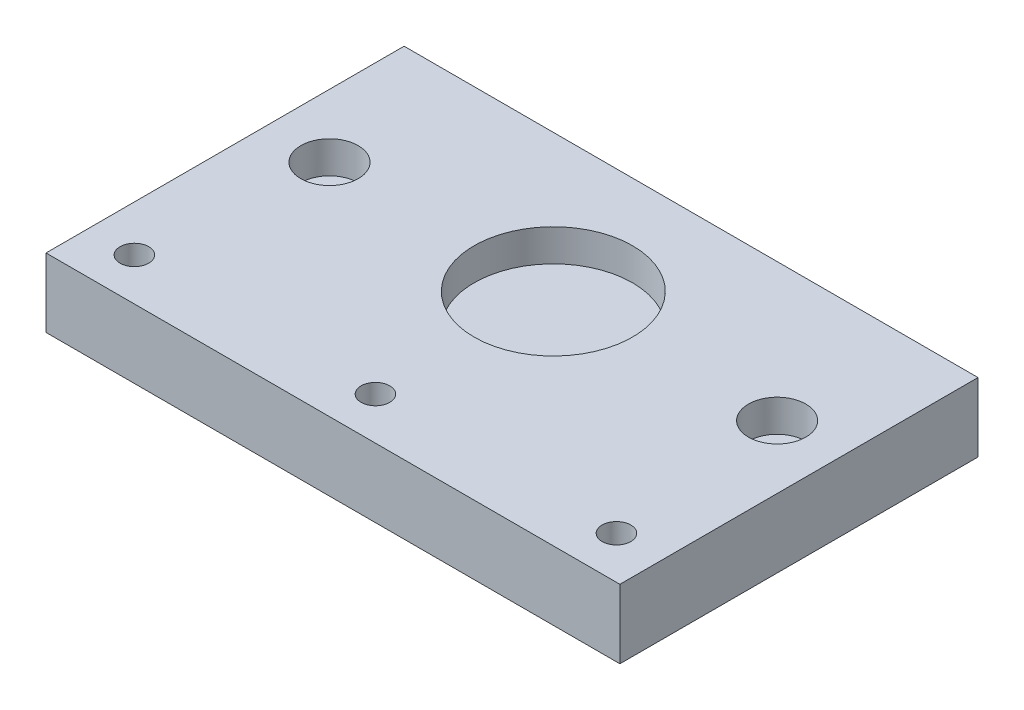
ISO-10303-21;
HEADER;
FILE_DESCRIPTION(('STEP AP214'),'2;1');
FILE_NAME('part.step','',(''),(''),'','','');
FILE_SCHEMA(('AUTOMOTIVE_DESIGN { 1 0 10303 214 1 1 1 1 }'));
ENDSEC;
DATA;
#1=APPLICATION_CONTEXT('core data for automotive mechanical design processes');
#2=APPLICATION_PROTOCOL_DEFINITION('international standard','automotive_design',2000,#1);
#3=PRODUCT_CONTEXT('',#1,'mechanical');
#4=PRODUCT('Part','Part','',(#3));
#5=PRODUCT_RELATED_PRODUCT_CATEGORY('part','',(#4));
#6=PRODUCT_DEFINITION_FORMATION('','',#4);
#7=PRODUCT_DEFINITION_CONTEXT('part definition',#1,'design');
#8=PRODUCT_DEFINITION('design','',#6,#7);
#9=PRODUCT_DEFINITION_SHAPE('','',#8);
#10=(LENGTH_UNIT() NAMED_UNIT(*) SI_UNIT(.MILLI.,.METRE.));
#11=(NAMED_UNIT(*) PLANE_ANGLE_UNIT() SI_UNIT($,.RADIAN.));
#12=(NAMED_UNIT(*) SI_UNIT($,.STERADIAN.) SOLID_ANGLE_UNIT());
#13=UNCERTAINTY_MEASURE_WITH_UNIT(LENGTH_MEASURE(1.E-05),#10,'distance_accuracy_value','');
#14=(GEOMETRIC_REPRESENTATION_CONTEXT(3) GLOBAL_UNCERTAINTY_ASSIGNED_CONTEXT((#13)) GLOBAL_UNIT_ASSIGNED_CONTEXT((#10,
#11,#12)) REPRESENTATION_CONTEXT('',''));
#15=CARTESIAN_POINT('',(0.,0.,0.));
#16=DIRECTION('',(0.,0.,1.));
#17=DIRECTION('',(1.,0.,0.));
#18=AXIS2_PLACEMENT_3D('',#15,#16,#17);
#19=CARTESIAN_POINT('',(-24.765,0.,15.24));
#20=DIRECTION('',(0.,-1.,0.));
#21=DIRECTION('',(0.,0.,-1.));
#22=AXIS2_PLACEMENT_3D('',#19,#20,#21);
#23=CYLINDRICAL_SURFACE('',#22,3.175);
#24=CARTESIAN_POINT('',(-24.765,-6.35,15.24));
#25=DIRECTION('',(0.,1.,0.));
#26=DIRECTION('',(0.,0.,1.));
#27=AXIS2_PLACEMENT_3D('',#24,#25,#26);
#28=CIRCLE('',#27,3.175);
#29=CARTESIAN_POINT('',(-24.765,-6.35,18.415));
#30=VERTEX_POINT('',#29);
#31=EDGE_CURVE('E118',#30,#30,#28,.F.);
#32=ORIENTED_EDGE('',*,*,#31,.F.);
#33=EDGE_LOOP('',(#32));
#34=FACE_BOUND('',#33,.T.);
#35=CARTESIAN_POINT('',(-24.765,-9.906,15.24));
#36=DIRECTION('',(0.,-1.,0.));
#37=DIRECTION('',(0.,0.,-1.));
#38=AXIS2_PLACEMENT_3D('',#35,#36,#37);
#39=CIRCLE('',#38,3.175);
#40=CARTESIAN_POINT('',(-24.765,-9.906,12.065));
#41=VERTEX_POINT('',#40);
#42=EDGE_CURVE('E11',#41,#41,#39,.F.);
#43=ORIENTED_EDGE('',*,*,#42,.F.);
#44=EDGE_LOOP('',(#43));
#45=FACE_BOUND('',#44,.T.);
#46=ADVANCED_FACE('F37',(#34,#45),#23,.F.);
#47=CARTESIAN_POINT('',(24.765,0.,15.24));
#48=DIRECTION('',(0.,-1.,0.));
#49=DIRECTION('',(0.,0.,-1.));
#50=AXIS2_PLACEMENT_3D('',#47,#48,#49);
#51=CYLINDRICAL_SURFACE('',#50,3.175);
#52=CARTESIAN_POINT('',(24.765,-6.35,15.24));
#53=DIRECTION('',(0.,1.,0.));
#54=DIRECTION('',(0.,0.,1.));
#55=AXIS2_PLACEMENT_3D('',#52,#53,#54);
#56=CIRCLE('',#55,3.175);
#57=CARTESIAN_POINT('',(24.765,-6.35,18.415));
#58=VERTEX_POINT('',#57);
#59=EDGE_CURVE('E115',#58,#58,#56,.F.);
#60=ORIENTED_EDGE('',*,*,#59,.F.);
#61=EDGE_LOOP('',(#60));
#62=FACE_BOUND('',#61,.T.);
#63=CARTESIAN_POINT('',(24.765,-9.906,15.24));
#64=DIRECTION('',(0.,-1.,0.));
#65=DIRECTION('',(0.,0.,-1.));
#66=AXIS2_PLACEMENT_3D('',#63,#64,#65);
#67=CIRCLE('',#66,3.175);
#68=CARTESIAN_POINT('',(24.765,-9.906,12.065));
#69=VERTEX_POINT('',#68);
#70=EDGE_CURVE('E45',#69,#69,#67,.F.);
#71=ORIENTED_EDGE('',*,*,#70,.F.);
#72=EDGE_LOOP('',(#71));
#73=FACE_BOUND('',#72,.T.);
#74=ADVANCED_FACE('F142',(#62,#73),#51,.F.);
#75=CARTESIAN_POINT('',(0.,-7.874,15.24));
#76=DIRECTION('',(0.,-1.,0.));
#77=DIRECTION('',(0.,0.,-1.));
#78=AXIS2_PLACEMENT_3D('',#75,#76,#77);
#79=CYLINDRICAL_SURFACE('',#78,8.763);
#80=CARTESIAN_POINT('',(0.,-6.34999999999999,15.24));
#81=DIRECTION('',(0.,-1.,0.));
#82=DIRECTION('',(0.,0.,-1.));
#83=AXIS2_PLACEMENT_3D('',#80,#81,#82);
#84=CIRCLE('',#83,8.763);
#85=CARTESIAN_POINT('',(0.,-6.34999999999999,6.47700000000001));
#86=VERTEX_POINT('',#85);
#87=EDGE_CURVE('E216',#86,#86,#84,.T.);
#88=ORIENTED_EDGE('',*,*,#87,.F.);
#89=EDGE_LOOP('',(#88));
#90=FACE_BOUND('',#89,.T.);
#91=CARTESIAN_POINT('',(0.,-9.906,15.24));
#92=DIRECTION('',(0.,-1.,0.));
#93=DIRECTION('',(0.,0.,-1.));
#94=AXIS2_PLACEMENT_3D('',#91,#92,#93);
#95=CIRCLE('',#94,8.763);
#96=CARTESIAN_POINT('',(0.,-9.906,6.47700000000001));
#97=VERTEX_POINT('',#96);
#98=EDGE_CURVE('E135',#97,#97,#95,.F.);
#99=ORIENTED_EDGE('',*,*,#98,.F.);
#100=EDGE_LOOP('',(#99));
#101=FACE_BOUND('',#100,.T.);
#102=ADVANCED_FACE('F144',(#90,#101),#79,.F.);
#103=CARTESIAN_POINT('',(-31.75,12.7,38.1));
#104=DIRECTION('',(1.,0.,0.));
#105=DIRECTION('',(0.,0.,-1.));
#106=AXIS2_PLACEMENT_3D('',#103,#104,#105);
#107=PLANE('',#106);
#108=DIRECTION('',(0.,0.,1.));
#109=VECTOR('',#108,1.);
#110=CARTESIAN_POINT('',(-31.75,-6.35,38.1));
#111=LINE('',#110,#109);
#112=CARTESIAN_POINT('',(-31.75,-6.35,0.));
#113=VERTEX_POINT('',#112);
#114=CARTESIAN_POINT('',(-31.75,-6.34999999999999,39.624));
#115=VERTEX_POINT('',#114);
#116=EDGE_CURVE('E52',#113,#115,#111,.T.);
#117=ORIENTED_EDGE('',*,*,#116,.F.);
#118=DIRECTION('',(0.,-1.,0.));
#119=VECTOR('',#118,1.);
#120=CARTESIAN_POINT('',(-31.75,12.7,0.));
#121=LINE('',#120,#119);
#122=CARTESIAN_POINT('',(-31.75,-13.97,0.));
#123=VERTEX_POINT('',#122);
#124=EDGE_CURVE('E85',#113,#123,#121,.T.);
#125=ORIENTED_EDGE('',*,*,#124,.T.);
#126=DIRECTION('',(0.,0.,-1.));
#127=VECTOR('',#126,1.);
#128=CARTESIAN_POINT('',(-31.75,-13.97,39.624));
#129=LINE('',#128,#127);
#130=CARTESIAN_POINT('',(-31.75,-13.97,39.624));
#131=VERTEX_POINT('',#130);
#132=EDGE_CURVE('E101',#131,#123,#129,.T.);
#133=ORIENTED_EDGE('',*,*,#132,.F.);
#134=DIRECTION('',(0.,-1.,0.));
#135=VECTOR('',#134,1.);
#136=CARTESIAN_POINT('',(-31.75,12.7,39.624));
#137=LINE('',#136,#135);
#138=EDGE_CURVE('E130',#115,#131,#137,.T.);
#139=ORIENTED_EDGE('',*,*,#138,.F.);
#140=EDGE_LOOP('',(#117,#125,#133,#139));
#141=FACE_BOUND('',#140,.T.);
#142=ADVANCED_FACE('F39',(#141),#107,.F.);
#143=CARTESIAN_POINT('',(31.75,12.7,38.1));
#144=DIRECTION('',(-1.,0.,0.));
#145=DIRECTION('',(0.,0.,1.));
#146=AXIS2_PLACEMENT_3D('',#143,#144,#145);
#147=PLANE('',#146);
#148=DIRECTION('',(0.,0.,-1.));
#149=VECTOR('',#148,1.);
#150=CARTESIAN_POINT('',(31.75,-6.35,38.1));
#151=LINE('',#150,#149);
#152=CARTESIAN_POINT('',(31.75,-6.35,39.624));
#153=VERTEX_POINT('',#152);
#154=CARTESIAN_POINT('',(31.75,-6.35,0.));
#155=VERTEX_POINT('',#154);
#156=EDGE_CURVE('E111',#153,#155,#151,.T.);
#157=ORIENTED_EDGE('',*,*,#156,.F.);
#158=DIRECTION('',(0.,1.,0.));
#159=VECTOR('',#158,1.);
#160=CARTESIAN_POINT('',(31.75,-11.43,39.624));
#161=LINE('',#160,#159);
#162=CARTESIAN_POINT('',(31.75,-13.97,39.624));
#163=VERTEX_POINT('',#162);
#164=EDGE_CURVE('E91',#163,#153,#161,.T.);
#165=ORIENTED_EDGE('',*,*,#164,.F.);
#166=DIRECTION('',(0.,0.,1.));
#167=VECTOR('',#166,1.);
#168=CARTESIAN_POINT('',(31.75,-13.97,0.));
#169=LINE('',#168,#167);
#170=CARTESIAN_POINT('',(31.75,-13.97,0.));
#171=VERTEX_POINT('',#170);
#172=EDGE_CURVE('E88',#171,#163,#169,.T.);
#173=ORIENTED_EDGE('',*,*,#172,.F.);
#174=DIRECTION('',(0.,1.,0.));
#175=VECTOR('',#174,1.);
#176=CARTESIAN_POINT('',(31.75,12.7,0.));
#177=LINE('',#176,#175);
#178=EDGE_CURVE('E76',#171,#155,#177,.T.);
#179=ORIENTED_EDGE('',*,*,#178,.T.);
#180=EDGE_LOOP('',(#157,#165,#173,#179));
#181=FACE_BOUND('',#180,.T.);
#182=ADVANCED_FACE('F89',(#181),#147,.F.);
#183=CARTESIAN_POINT('',(0.,0.,0.));
#184=DIRECTION('',(0.,0.,1.));
#185=DIRECTION('',(1.,0.,0.));
#186=AXIS2_PLACEMENT_3D('',#183,#184,#185);
#187=PLANE('',#186);
#188=DIRECTION('',(-1.,0.,0.));
#189=VECTOR('',#188,1.);
#190=CARTESIAN_POINT('',(0.,-6.35,0.));
#191=LINE('',#190,#189);
#192=EDGE_CURVE('E57',#155,#113,#191,.T.);
#193=ORIENTED_EDGE('',*,*,#192,.F.);
#194=ORIENTED_EDGE('',*,*,#178,.F.);
#195=DIRECTION('',(1.,0.,0.));
#196=VECTOR('',#195,1.);
#197=CARTESIAN_POINT('',(-31.75,-13.97,0.));
#198=LINE('',#197,#196);
#199=EDGE_CURVE('E81',#123,#171,#198,.T.);
#200=ORIENTED_EDGE('',*,*,#199,.F.);
#201=ORIENTED_EDGE('',*,*,#124,.F.);
#202=EDGE_LOOP('',(#193,#194,#200,#201));
#203=FACE_BOUND('',#202,.T.);
#204=ADVANCED_FACE('F78',(#203),#187,.F.);
#205=CARTESIAN_POINT('',(26.67,-38.1,34.925));
#206=DIRECTION('',(0.,1.,0.));
#207=DIRECTION('',(0.,0.,1.));
#208=AXIS2_PLACEMENT_3D('',#205,#206,#207);
#209=CYLINDRICAL_SURFACE('',#208,1.5875);
#210=CARTESIAN_POINT('',(26.67,-6.35,34.925));
#211=DIRECTION('',(0.,1.,0.));
#212=DIRECTION('',(0.,0.,1.));
#213=AXIS2_PLACEMENT_3D('',#210,#211,#212);
#214=CIRCLE('',#213,1.5875);
#215=CARTESIAN_POINT('',(26.67,-6.35,36.5125));
#216=VERTEX_POINT('',#215);
#217=EDGE_CURVE('E127',#216,#216,#214,.F.);
#218=ORIENTED_EDGE('',*,*,#217,.F.);
#219=EDGE_LOOP('',(#218));
#220=FACE_BOUND('',#219,.T.);
#221=CARTESIAN_POINT('',(26.67,-13.97,34.925));
#222=DIRECTION('',(0.,-1.,0.));
#223=DIRECTION('',(0.,0.,-1.));
#224=AXIS2_PLACEMENT_3D('',#221,#222,#223);
#225=CIRCLE('',#224,1.5875);
#226=CARTESIAN_POINT('',(26.67,-13.97,33.3375));
#227=VERTEX_POINT('',#226);
#228=EDGE_CURVE('E102',#227,#227,#225,.T.);
#229=ORIENTED_EDGE('',*,*,#228,.T.);
#230=EDGE_LOOP('',(#229));
#231=FACE_BOUND('',#230,.T.);
#232=ADVANCED_FACE('F158',(#220,#231),#209,.F.);
#233=CARTESIAN_POINT('',(0.,-38.1,34.925));
#234=DIRECTION('',(0.,1.,0.));
#235=DIRECTION('',(0.,0.,1.));
#236=AXIS2_PLACEMENT_3D('',#233,#234,#235);
#237=CYLINDRICAL_SURFACE('',#236,1.5875);
#238=CARTESIAN_POINT('',(0.,-6.35,34.925));
#239=DIRECTION('',(0.,1.,0.));
#240=DIRECTION('',(0.,0.,1.));
#241=AXIS2_PLACEMENT_3D('',#238,#239,#240);
#242=CIRCLE('',#241,1.5875);
#243=CARTESIAN_POINT('',(0.,-6.35,36.5125));
#244=VERTEX_POINT('',#243);
#245=EDGE_CURVE('E124',#244,#244,#242,.F.);
#246=ORIENTED_EDGE('',*,*,#245,.F.);
#247=EDGE_LOOP('',(#246));
#248=FACE_BOUND('',#247,.T.);
#249=CARTESIAN_POINT('',(0.,-13.97,34.925));
#250=DIRECTION('',(0.,-1.,0.));
#251=DIRECTION('',(0.,0.,-1.));
#252=AXIS2_PLACEMENT_3D('',#249,#250,#251);
#253=CIRCLE('',#252,1.5875);
#254=CARTESIAN_POINT('',(0.,-13.97,33.3375));
#255=VERTEX_POINT('',#254);
#256=EDGE_CURVE('E105',#255,#255,#253,.T.);
#257=ORIENTED_EDGE('',*,*,#256,.T.);
#258=EDGE_LOOP('',(#257));
#259=FACE_BOUND('',#258,.T.);
#260=ADVANCED_FACE('F185',(#248,#259),#237,.F.);
#261=CARTESIAN_POINT('',(-26.67,-38.1,34.925));
#262=DIRECTION('',(0.,1.,0.));
#263=DIRECTION('',(0.,0.,1.));
#264=AXIS2_PLACEMENT_3D('',#261,#262,#263);
#265=CYLINDRICAL_SURFACE('',#264,1.5875);
#266=CARTESIAN_POINT('',(-26.67,-6.35,34.925));
#267=DIRECTION('',(0.,1.,0.));
#268=DIRECTION('',(0.,0.,1.));
#269=AXIS2_PLACEMENT_3D('',#266,#267,#268);
#270=CIRCLE('',#269,1.5875);
#271=CARTESIAN_POINT('',(-26.67,-6.35,36.5125));
#272=VERTEX_POINT('',#271);
#273=EDGE_CURVE('E121',#272,#272,#270,.F.);
#274=ORIENTED_EDGE('',*,*,#273,.F.);
#275=EDGE_LOOP('',(#274));
#276=FACE_BOUND('',#275,.T.);
#277=CARTESIAN_POINT('',(-26.67,-13.97,34.925));
#278=DIRECTION('',(0.,-1.,0.));
#279=DIRECTION('',(0.,0.,-1.));
#280=AXIS2_PLACEMENT_3D('',#277,#278,#279);
#281=CIRCLE('',#280,1.5875);
#282=CARTESIAN_POINT('',(-26.67,-13.97,33.3375));
#283=VERTEX_POINT('',#282);
#284=EDGE_CURVE('E214',#283,#283,#281,.T.);
#285=ORIENTED_EDGE('',*,*,#284,.T.);
#286=EDGE_LOOP('',(#285));
#287=FACE_BOUND('',#286,.T.);
#288=ADVANCED_FACE('F203',(#276,#287),#265,.F.);
#289=CARTESIAN_POINT('',(0.,0.,39.624));
#290=DIRECTION('',(0.,0.,1.));
#291=DIRECTION('',(1.,0.,0.));
#292=AXIS2_PLACEMENT_3D('',#289,#290,#291);
#293=PLANE('',#292);
#294=ORIENTED_EDGE('',*,*,#164,.T.);
#295=DIRECTION('',(-1.,0.,0.));
#296=VECTOR('',#295,1.);
#297=CARTESIAN_POINT('',(0.,-6.35,39.624));
#298=LINE('',#297,#296);
#299=EDGE_CURVE('E84',#153,#115,#298,.T.);
#300=ORIENTED_EDGE('',*,*,#299,.T.);
#301=ORIENTED_EDGE('',*,*,#138,.T.);
#302=DIRECTION('',(-1.,0.,0.));
#303=VECTOR('',#302,1.);
#304=CARTESIAN_POINT('',(31.75,-13.97,39.624));
#305=LINE('',#304,#303);
#306=EDGE_CURVE('E95',#163,#131,#305,.T.);
#307=ORIENTED_EDGE('',*,*,#306,.F.);
#308=EDGE_LOOP('',(#294,#300,#301,#307));
#309=FACE_BOUND('',#308,.T.);
#310=ADVANCED_FACE('F168',(#309),#293,.T.);
#311=CARTESIAN_POINT('',(0.,-6.35,15.24));
#312=DIRECTION('',(0.,1.,0.));
#313=DIRECTION('',(0.,0.,1.));
#314=AXIS2_PLACEMENT_3D('',#311,#312,#313);
#315=PLANE('',#314);
#316=ORIENTED_EDGE('',*,*,#87,.T.);
#317=EDGE_LOOP('',(#316));
#318=FACE_BOUND('',#317,.T.);
#319=ORIENTED_EDGE('',*,*,#192,.T.);
#320=ORIENTED_EDGE('',*,*,#116,.T.);
#321=ORIENTED_EDGE('',*,*,#299,.F.);
#322=ORIENTED_EDGE('',*,*,#156,.T.);
#323=EDGE_LOOP('',(#319,#320,#321,#322));
#324=FACE_BOUND('',#323,.T.);
#325=ORIENTED_EDGE('',*,*,#59,.T.);
#326=EDGE_LOOP('',(#325));
#327=FACE_BOUND('',#326,.T.);
#328=ORIENTED_EDGE('',*,*,#31,.T.);
#329=EDGE_LOOP('',(#328));
#330=FACE_BOUND('',#329,.T.);
#331=ORIENTED_EDGE('',*,*,#273,.T.);
#332=EDGE_LOOP('',(#331));
#333=FACE_BOUND('',#332,.T.);
#334=ORIENTED_EDGE('',*,*,#245,.T.);
#335=EDGE_LOOP('',(#334));
#336=FACE_BOUND('',#335,.T.);
#337=ORIENTED_EDGE('',*,*,#217,.T.);
#338=EDGE_LOOP('',(#337));
#339=FACE_BOUND('',#338,.T.);
#340=ADVANCED_FACE('F169',(#318,#324,#327,#330,#333,#336,#339),#315,.T.);
#341=CARTESIAN_POINT('',(0.,-13.97,0.));
#342=DIRECTION('',(0.,-1.,0.));
#343=DIRECTION('',(0.,0.,-1.));
#344=AXIS2_PLACEMENT_3D('',#341,#342,#343);
#345=PLANE('',#344);
#346=ORIENTED_EDGE('',*,*,#284,.F.);
#347=EDGE_LOOP('',(#346));
#348=FACE_BOUND('',#347,.T.);
#349=ORIENTED_EDGE('',*,*,#228,.F.);
#350=EDGE_LOOP('',(#349));
#351=FACE_BOUND('',#350,.T.);
#352=ORIENTED_EDGE('',*,*,#199,.T.);
#353=ORIENTED_EDGE('',*,*,#172,.T.);
#354=ORIENTED_EDGE('',*,*,#306,.T.);
#355=ORIENTED_EDGE('',*,*,#132,.T.);
#356=EDGE_LOOP('',(#352,#353,#354,#355));
#357=FACE_BOUND('',#356,.T.);
#358=ORIENTED_EDGE('',*,*,#256,.F.);
#359=EDGE_LOOP('',(#358));
#360=FACE_BOUND('',#359,.T.);
#361=ADVANCED_FACE('F98',(#348,#351,#357,#360),#345,.T.);
#362=CARTESIAN_POINT('',(0.,-9.906,15.24));
#363=DIRECTION('',(0.,-1.,0.));
#364=DIRECTION('',(0.,0.,-1.));
#365=AXIS2_PLACEMENT_3D('',#362,#363,#364);
#366=PLANE('',#365);
#367=ORIENTED_EDGE('',*,*,#98,.T.);
#368=EDGE_LOOP('',(#367));
#369=FACE_BOUND('',#368,.T.);
#370=ADVANCED_FACE('F190',(#369),#366,.F.);
#371=CARTESIAN_POINT('',(24.765,-9.906,15.24));
#372=DIRECTION('',(0.,-1.,0.));
#373=DIRECTION('',(0.,0.,-1.));
#374=AXIS2_PLACEMENT_3D('',#371,#372,#373);
#375=PLANE('',#374);
#376=ORIENTED_EDGE('',*,*,#70,.T.);
#377=EDGE_LOOP('',(#376));
#378=FACE_BOUND('',#377,.T.);
#379=ADVANCED_FACE('F140',(#378),#375,.F.);
#380=CARTESIAN_POINT('',(-24.765,-9.906,15.24));
#381=DIRECTION('',(0.,-1.,0.));
#382=DIRECTION('',(0.,0.,-1.));
#383=AXIS2_PLACEMENT_3D('',#380,#381,#382);
#384=PLANE('',#383);
#385=ORIENTED_EDGE('',*,*,#42,.T.);
#386=EDGE_LOOP('',(#385));
#387=FACE_BOUND('',#386,.T.);
#388=ADVANCED_FACE('F281',(#387),#384,.F.);
#389=CLOSED_SHELL('',(#46,#74,#102,#142,#182,#204,#232,#260,#288,#310,#340,#361,#370,#379,#388));
#390=MANIFOLD_SOLID_BREP('B2',#389);
#391=ADVANCED_BREP_SHAPE_REPRESENTATION('',(#18,#390),#14);
#392=SHAPE_DEFINITION_REPRESENTATION(#9,#391);
ENDSEC;
END-ISO-10303-21;
